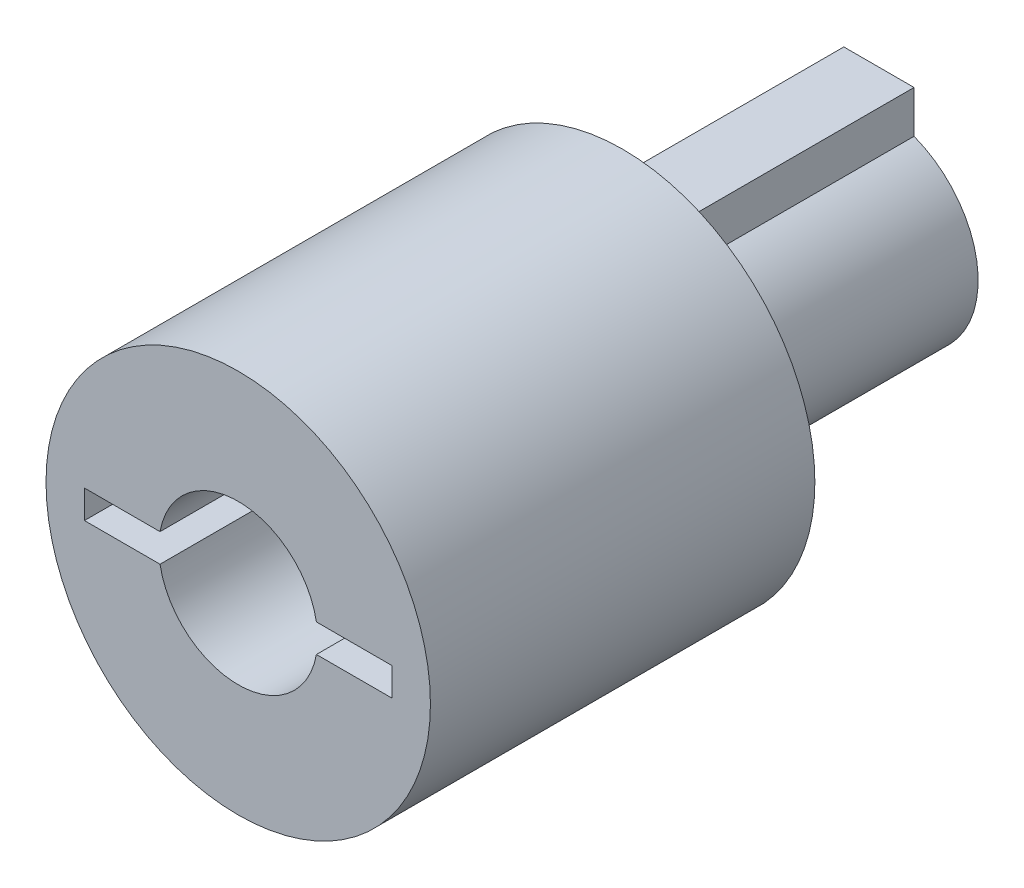
ISO-10303-21;
HEADER;
FILE_DESCRIPTION(('STEP AP214'),'2;1');
FILE_NAME('part.step','',(''),(''),'','','');
FILE_SCHEMA(('AUTOMOTIVE_DESIGN { 1 0 10303 214 1 1 1 1 }'));
ENDSEC;
DATA;
#1=APPLICATION_CONTEXT('core data for automotive mechanical design processes');
#2=APPLICATION_PROTOCOL_DEFINITION('international standard','automotive_design',2000,#1);
#3=PRODUCT_CONTEXT('',#1,'mechanical');
#4=PRODUCT('Part','Part','',(#3));
#5=PRODUCT_RELATED_PRODUCT_CATEGORY('part','',(#4));
#6=PRODUCT_DEFINITION_FORMATION('','',#4);
#7=PRODUCT_DEFINITION_CONTEXT('part definition',#1,'design');
#8=PRODUCT_DEFINITION('design','',#6,#7);
#9=PRODUCT_DEFINITION_SHAPE('','',#8);
#10=(LENGTH_UNIT() NAMED_UNIT(*) SI_UNIT(.MILLI.,.METRE.));
#11=(NAMED_UNIT(*) PLANE_ANGLE_UNIT() SI_UNIT($,.RADIAN.));
#12=(NAMED_UNIT(*) SI_UNIT($,.STERADIAN.) SOLID_ANGLE_UNIT());
#13=UNCERTAINTY_MEASURE_WITH_UNIT(LENGTH_MEASURE(1.E-05),#10,'distance_accuracy_value','');
#14=(GEOMETRIC_REPRESENTATION_CONTEXT(3) GLOBAL_UNCERTAINTY_ASSIGNED_CONTEXT((#13)) GLOBAL_UNIT_ASSIGNED_CONTEXT((#10,
#11,#12)) REPRESENTATION_CONTEXT('',''));
#15=CARTESIAN_POINT('',(0.,0.,0.));
#16=DIRECTION('',(0.,0.,1.));
#17=DIRECTION('',(1.,0.,0.));
#18=AXIS2_PLACEMENT_3D('',#15,#16,#17);
#19=CARTESIAN_POINT('',(0.,0.,15.));
#20=DIRECTION('',(0.,0.,1.));
#21=DIRECTION('',(1.,0.,0.));
#22=AXIS2_PLACEMENT_3D('',#19,#20,#21);
#23=PLANE('',#22);
#24=CARTESIAN_POINT('',(0.,0.,15.));
#25=DIRECTION('',(0.,0.,1.));
#26=DIRECTION('',(1.,0.,0.));
#27=AXIS2_PLACEMENT_3D('',#24,#25,#26);
#28=CIRCLE('',#27,7.5);
#29=CARTESIAN_POINT('',(7.5,0.,15.));
#30=VERTEX_POINT('',#29);
#31=EDGE_CURVE('E192',#30,#30,#28,.T.);
#32=ORIENTED_EDGE('',*,*,#31,.T.);
#33=EDGE_LOOP('',(#32));
#34=FACE_BOUND('',#33,.T.);
#35=CARTESIAN_POINT('',(0.,0.,15.));
#36=DIRECTION('',(0.,0.,1.));
#37=DIRECTION('',(1.,0.,0.));
#38=AXIS2_PLACEMENT_3D('',#35,#36,#37);
#39=CIRCLE('',#38,3.1);
#40=CARTESIAN_POINT('',(3.05081956201936,0.55,15.));
#41=VERTEX_POINT('',#40);
#42=CARTESIAN_POINT('',(-3.05081956201936,0.55,15.));
#43=VERTEX_POINT('',#42);
#44=EDGE_CURVE('E189',#41,#43,#39,.T.);
#45=ORIENTED_EDGE('',*,*,#44,.F.);
#46=DIRECTION('',(1.,0.,0.));
#47=VECTOR('',#46,1.);
#48=CARTESIAN_POINT('',(0.,0.55,15.));
#49=LINE('',#48,#47);
#50=CARTESIAN_POINT('',(6.,0.55,15.));
#51=VERTEX_POINT('',#50);
#52=EDGE_CURVE('E158',#41,#51,#49,.T.);
#53=ORIENTED_EDGE('',*,*,#52,.T.);
#54=DIRECTION('',(0.,1.,0.));
#55=VECTOR('',#54,1.);
#56=CARTESIAN_POINT('',(6.,0.,15.));
#57=LINE('',#56,#55);
#58=CARTESIAN_POINT('',(6.,-0.55,15.));
#59=VERTEX_POINT('',#58);
#60=EDGE_CURVE('E168',#59,#51,#57,.T.);
#61=ORIENTED_EDGE('',*,*,#60,.F.);
#62=DIRECTION('',(-1.,0.,0.));
#63=VECTOR('',#62,1.);
#64=CARTESIAN_POINT('',(0.,-0.55,15.));
#65=LINE('',#64,#63);
#66=CARTESIAN_POINT('',(3.05081956201936,-0.55,15.));
#67=VERTEX_POINT('',#66);
#68=EDGE_CURVE('E165',#59,#67,#65,.T.);
#69=ORIENTED_EDGE('',*,*,#68,.T.);
#70=CARTESIAN_POINT('',(-3.05081956201936,-0.55,15.));
#71=VERTEX_POINT('',#70);
#72=EDGE_CURVE('E183',#71,#67,#39,.T.);
#73=ORIENTED_EDGE('',*,*,#72,.F.);
#74=CARTESIAN_POINT('',(-6.,-0.55,15.));
#75=VERTEX_POINT('',#74);
#76=EDGE_CURVE('E164',#71,#75,#65,.T.);
#77=ORIENTED_EDGE('',*,*,#76,.T.);
#78=DIRECTION('',(0.,-1.,0.));
#79=VECTOR('',#78,1.);
#80=CARTESIAN_POINT('',(-6.,0.,15.));
#81=LINE('',#80,#79);
#82=CARTESIAN_POINT('',(-6.,0.55,15.));
#83=VERTEX_POINT('',#82);
#84=EDGE_CURVE('E149',#83,#75,#81,.T.);
#85=ORIENTED_EDGE('',*,*,#84,.F.);
#86=EDGE_CURVE('E155',#83,#43,#49,.T.);
#87=ORIENTED_EDGE('',*,*,#86,.T.);
#88=EDGE_LOOP('',(#45,#53,#61,#69,#73,#77,#85,#87));
#89=FACE_BOUND('',#88,.T.);
#90=ADVANCED_FACE('F33',(#34,#89),#23,.T.);
#91=CARTESIAN_POINT('',(0.,0.,6.));
#92=DIRECTION('',(0.,0.,1.));
#93=DIRECTION('',(1.,0.,0.));
#94=AXIS2_PLACEMENT_3D('',#91,#92,#93);
#95=CYLINDRICAL_SURFACE('',#94,3.1);
#96=DIRECTION('',(0.,0.,1.));
#97=VECTOR('',#96,1.);
#98=CARTESIAN_POINT('',(3.05081956201936,0.55,6.));
#99=LINE('',#98,#97);
#100=CARTESIAN_POINT('',(3.05081956201936,0.55,6.));
#101=VERTEX_POINT('',#100);
#102=EDGE_CURVE('E181',#41,#101,#99,.F.);
#103=ORIENTED_EDGE('',*,*,#102,.F.);
#104=ORIENTED_EDGE('',*,*,#44,.T.);
#105=DIRECTION('',(0.,0.,1.));
#106=VECTOR('',#105,1.);
#107=CARTESIAN_POINT('',(-3.05081956201936,0.55,6.));
#108=LINE('',#107,#106);
#109=CARTESIAN_POINT('',(-3.05081956201936,0.55,6.));
#110=VERTEX_POINT('',#109);
#111=EDGE_CURVE('E179',#110,#43,#108,.T.);
#112=ORIENTED_EDGE('',*,*,#111,.F.);
#113=CARTESIAN_POINT('',(0.,0.,6.));
#114=DIRECTION('',(0.,0.,1.));
#115=DIRECTION('',(1.,0.,0.));
#116=AXIS2_PLACEMENT_3D('',#113,#114,#115);
#117=CIRCLE('',#116,3.1);
#118=EDGE_CURVE('E184',#101,#110,#117,.T.);
#119=ORIENTED_EDGE('',*,*,#118,.F.);
#120=EDGE_LOOP('',(#103,#104,#112,#119));
#121=FACE_BOUND('',#120,.T.);
#122=ADVANCED_FACE('F244',(#121),#95,.F.);
#123=DIRECTION('',(0.,0.,1.));
#124=VECTOR('',#123,1.);
#125=CARTESIAN_POINT('',(-3.05081956201936,-0.55,6.));
#126=LINE('',#125,#124);
#127=CARTESIAN_POINT('',(-3.05081956201936,-0.55,6.));
#128=VERTEX_POINT('',#127);
#129=EDGE_CURVE('E48',#71,#128,#126,.F.);
#130=ORIENTED_EDGE('',*,*,#129,.F.);
#131=ORIENTED_EDGE('',*,*,#72,.T.);
#132=DIRECTION('',(0.,0.,1.));
#133=VECTOR('',#132,1.);
#134=CARTESIAN_POINT('',(3.05081956201936,-0.55,6.));
#135=LINE('',#134,#133);
#136=CARTESIAN_POINT('',(3.05081956201936,-0.55,6.));
#137=VERTEX_POINT('',#136);
#138=EDGE_CURVE('E173',#137,#67,#135,.T.);
#139=ORIENTED_EDGE('',*,*,#138,.F.);
#140=EDGE_CURVE('E188',#128,#137,#117,.T.);
#141=ORIENTED_EDGE('',*,*,#140,.F.);
#142=EDGE_LOOP('',(#130,#131,#139,#141));
#143=FACE_BOUND('',#142,.T.);
#144=ADVANCED_FACE('F228',(#143),#95,.F.);
#145=CARTESIAN_POINT('',(0.,0.,6.));
#146=DIRECTION('',(0.,0.,1.));
#147=DIRECTION('',(1.,0.,0.));
#148=AXIS2_PLACEMENT_3D('',#145,#146,#147);
#149=PLANE('',#148);
#150=ORIENTED_EDGE('',*,*,#118,.T.);
#151=DIRECTION('',(1.,0.,0.));
#152=VECTOR('',#151,1.);
#153=CARTESIAN_POINT('',(0.,0.55,6.));
#154=LINE('',#153,#152);
#155=EDGE_CURVE('E11',#110,#101,#154,.T.);
#156=ORIENTED_EDGE('',*,*,#155,.T.);
#157=EDGE_LOOP('',(#150,#156));
#158=FACE_BOUND('',#157,.T.);
#159=ADVANCED_FACE('F247',(#158),#149,.T.);
#160=ORIENTED_EDGE('',*,*,#140,.T.);
#161=DIRECTION('',(-1.,0.,0.));
#162=VECTOR('',#161,1.);
#163=CARTESIAN_POINT('',(0.,-0.55,6.));
#164=LINE('',#163,#162);
#165=EDGE_CURVE('E41',#137,#128,#164,.T.);
#166=ORIENTED_EDGE('',*,*,#165,.T.);
#167=EDGE_LOOP('',(#160,#166));
#168=FACE_BOUND('',#167,.T.);
#169=ADVANCED_FACE('F225',(#168),#149,.T.);
#170=CARTESIAN_POINT('',(1.37,5.27,-10.));
#171=DIRECTION('',(0.,1.,0.));
#172=DIRECTION('',(0.,0.,1.));
#173=AXIS2_PLACEMENT_3D('',#170,#171,#172);
#174=PLANE('',#173);
#175=DIRECTION('',(-1.,0.,0.));
#176=VECTOR('',#175,1.);
#177=CARTESIAN_POINT('',(1.37,5.27,0.));
#178=LINE('',#177,#176);
#179=CARTESIAN_POINT('',(1.37,5.27,0.));
#180=VERTEX_POINT('',#179);
#181=CARTESIAN_POINT('',(-1.37,5.27,0.));
#182=VERTEX_POINT('',#181);
#183=EDGE_CURVE('E195',#180,#182,#178,.T.);
#184=ORIENTED_EDGE('',*,*,#183,.F.);
#185=DIRECTION('',(0.,0.,1.));
#186=VECTOR('',#185,1.);
#187=CARTESIAN_POINT('',(1.37,5.27,-10.));
#188=LINE('',#187,#186);
#189=CARTESIAN_POINT('',(1.37,5.27,-10.));
#190=VERTEX_POINT('',#189);
#191=EDGE_CURVE('E57',#190,#180,#188,.T.);
#192=ORIENTED_EDGE('',*,*,#191,.F.);
#193=DIRECTION('',(-1.,0.,0.));
#194=VECTOR('',#193,1.);
#195=CARTESIAN_POINT('',(1.37,5.27,-10.));
#196=LINE('',#195,#194);
#197=CARTESIAN_POINT('',(-1.37,5.27,-10.));
#198=VERTEX_POINT('',#197);
#199=EDGE_CURVE('E198',#190,#198,#196,.T.);
#200=ORIENTED_EDGE('',*,*,#199,.T.);
#201=DIRECTION('',(0.,0.,1.));
#202=VECTOR('',#201,1.);
#203=CARTESIAN_POINT('',(-1.37,5.27,-10.));
#204=LINE('',#203,#202);
#205=EDGE_CURVE('E83',#198,#182,#204,.T.);
#206=ORIENTED_EDGE('',*,*,#205,.T.);
#207=EDGE_LOOP('',(#184,#192,#200,#206));
#208=FACE_BOUND('',#207,.T.);
#209=ADVANCED_FACE('F35',(#208),#174,.T.);
#210=CARTESIAN_POINT('',(1.37,3.61939221417077,-10.));
#211=DIRECTION('',(1.,0.,0.));
#212=DIRECTION('',(0.,0.,-1.));
#213=AXIS2_PLACEMENT_3D('',#210,#211,#212);
#214=PLANE('',#213);
#215=DIRECTION('',(0.,1.,0.));
#216=VECTOR('',#215,1.);
#217=CARTESIAN_POINT('',(1.37,3.61939221417077,0.));
#218=LINE('',#217,#216);
#219=CARTESIAN_POINT('',(1.37,3.61939221417077,0.));
#220=VERTEX_POINT('',#219);
#221=EDGE_CURVE('E201',#220,#180,#218,.T.);
#222=ORIENTED_EDGE('',*,*,#221,.F.);
#223=DIRECTION('',(0.,0.,1.));
#224=VECTOR('',#223,1.);
#225=CARTESIAN_POINT('',(1.37,3.61939221417077,-10.));
#226=LINE('',#225,#224);
#227=CARTESIAN_POINT('',(1.37,3.61939221417077,-10.));
#228=VERTEX_POINT('',#227);
#229=EDGE_CURVE('E76',#228,#220,#226,.T.);
#230=ORIENTED_EDGE('',*,*,#229,.F.);
#231=DIRECTION('',(0.,1.,0.));
#232=VECTOR('',#231,1.);
#233=CARTESIAN_POINT('',(1.37,3.61939221417077,-10.));
#234=LINE('',#233,#232);
#235=EDGE_CURVE('E205',#228,#190,#234,.T.);
#236=ORIENTED_EDGE('',*,*,#235,.T.);
#237=ORIENTED_EDGE('',*,*,#191,.T.);
#238=EDGE_LOOP('',(#222,#230,#236,#237));
#239=FACE_BOUND('',#238,.T.);
#240=ADVANCED_FACE('F276',(#239),#214,.T.);
#241=CARTESIAN_POINT('',(0.,0.,-10.));
#242=DIRECTION('',(0.,0.,1.));
#243=DIRECTION('',(1.,0.,0.));
#244=AXIS2_PLACEMENT_3D('',#241,#242,#243);
#245=CYLINDRICAL_SURFACE('',#244,3.87);
#246=CARTESIAN_POINT('',(0.,0.,0.));
#247=DIRECTION('',(0.,0.,1.));
#248=DIRECTION('',(1.,0.,0.));
#249=AXIS2_PLACEMENT_3D('',#246,#247,#248);
#250=CIRCLE('',#249,3.87);
#251=CARTESIAN_POINT('',(-1.37,3.61939221417077,0.));
#252=VERTEX_POINT('',#251);
#253=EDGE_CURVE('E213',#252,#220,#250,.T.);
#254=ORIENTED_EDGE('',*,*,#253,.F.);
#255=DIRECTION('',(0.,0.,1.));
#256=VECTOR('',#255,1.);
#257=CARTESIAN_POINT('',(-1.37,3.61939221417077,-10.));
#258=LINE('',#257,#256);
#259=CARTESIAN_POINT('',(-1.37,3.61939221417077,-10.));
#260=VERTEX_POINT('',#259);
#261=EDGE_CURVE('E220',#260,#252,#258,.T.);
#262=ORIENTED_EDGE('',*,*,#261,.F.);
#263=CARTESIAN_POINT('',(0.,0.,-10.));
#264=DIRECTION('',(0.,0.,1.));
#265=DIRECTION('',(1.,0.,0.));
#266=AXIS2_PLACEMENT_3D('',#263,#264,#265);
#267=CIRCLE('',#266,3.87);
#268=EDGE_CURVE('E203',#260,#228,#267,.T.);
#269=ORIENTED_EDGE('',*,*,#268,.T.);
#270=ORIENTED_EDGE('',*,*,#229,.T.);
#271=EDGE_LOOP('',(#254,#262,#269,#270));
#272=FACE_BOUND('',#271,.T.);
#273=ADVANCED_FACE('F279',(#272),#245,.T.);
#274=CARTESIAN_POINT('',(-1.37,5.27,-10.));
#275=DIRECTION('',(-1.,0.,0.));
#276=DIRECTION('',(0.,0.,1.));
#277=AXIS2_PLACEMENT_3D('',#274,#275,#276);
#278=PLANE('',#277);
#279=DIRECTION('',(0.,-1.,0.));
#280=VECTOR('',#279,1.);
#281=CARTESIAN_POINT('',(-1.37,5.27,0.));
#282=LINE('',#281,#280);
#283=EDGE_CURVE('E210',#182,#252,#282,.T.);
#284=ORIENTED_EDGE('',*,*,#283,.F.);
#285=ORIENTED_EDGE('',*,*,#205,.F.);
#286=DIRECTION('',(0.,-1.,0.));
#287=VECTOR('',#286,1.);
#288=CARTESIAN_POINT('',(-1.37,5.27,-10.));
#289=LINE('',#288,#287);
#290=EDGE_CURVE('E200',#198,#260,#289,.T.);
#291=ORIENTED_EDGE('',*,*,#290,.T.);
#292=ORIENTED_EDGE('',*,*,#261,.T.);
#293=EDGE_LOOP('',(#284,#285,#291,#292));
#294=FACE_BOUND('',#293,.T.);
#295=ADVANCED_FACE('F274',(#294),#278,.T.);
#296=CARTESIAN_POINT('',(0.,0.,-10.));
#297=DIRECTION('',(0.,0.,1.));
#298=DIRECTION('',(1.,0.,0.));
#299=AXIS2_PLACEMENT_3D('',#296,#297,#298);
#300=PLANE('',#299);
#301=ORIENTED_EDGE('',*,*,#199,.F.);
#302=ORIENTED_EDGE('',*,*,#235,.F.);
#303=ORIENTED_EDGE('',*,*,#268,.F.);
#304=ORIENTED_EDGE('',*,*,#290,.F.);
#305=EDGE_LOOP('',(#301,#302,#303,#304));
#306=FACE_BOUND('',#305,.T.);
#307=ADVANCED_FACE('F267',(#306),#300,.F.);
#308=CARTESIAN_POINT('',(0.,0.,0.));
#309=DIRECTION('',(0.,0.,1.));
#310=DIRECTION('',(1.,0.,0.));
#311=AXIS2_PLACEMENT_3D('',#308,#309,#310);
#312=PLANE('',#311);
#313=CARTESIAN_POINT('',(0.,0.,0.));
#314=DIRECTION('',(0.,0.,1.));
#315=DIRECTION('',(1.,0.,0.));
#316=AXIS2_PLACEMENT_3D('',#313,#314,#315);
#317=CIRCLE('',#316,7.5);
#318=CARTESIAN_POINT('',(7.5,0.,0.));
#319=VERTEX_POINT('',#318);
#320=EDGE_CURVE('E187',#319,#319,#317,.T.);
#321=ORIENTED_EDGE('',*,*,#320,.F.);
#322=EDGE_LOOP('',(#321));
#323=FACE_BOUND('',#322,.T.);
#324=ORIENTED_EDGE('',*,*,#221,.T.);
#325=ORIENTED_EDGE('',*,*,#183,.T.);
#326=ORIENTED_EDGE('',*,*,#283,.T.);
#327=ORIENTED_EDGE('',*,*,#253,.T.);
#328=EDGE_LOOP('',(#324,#325,#326,#327));
#329=FACE_BOUND('',#328,.T.);
#330=ADVANCED_FACE('F263',(#323,#329),#312,.F.);
#331=CARTESIAN_POINT('',(0.,0.,15.));
#332=DIRECTION('',(0.,0.,-1.));
#333=DIRECTION('',(-1.,0.,0.));
#334=AXIS2_PLACEMENT_3D('',#331,#332,#333);
#335=CYLINDRICAL_SURFACE('',#334,7.5);
#336=ORIENTED_EDGE('',*,*,#31,.F.);
#337=EDGE_LOOP('',(#336));
#338=FACE_BOUND('',#337,.T.);
#339=ORIENTED_EDGE('',*,*,#320,.T.);
#340=EDGE_LOOP('',(#339));
#341=FACE_BOUND('',#340,.T.);
#342=ADVANCED_FACE('F266',(#338,#341),#335,.T.);
#343=CARTESIAN_POINT('',(0.,0.55,2.));
#344=DIRECTION('',(0.,-1.,0.));
#345=DIRECTION('',(0.,0.,-1.));
#346=AXIS2_PLACEMENT_3D('',#343,#344,#345);
#347=PLANE('',#346);
#348=ORIENTED_EDGE('',*,*,#102,.T.);
#349=ORIENTED_EDGE('',*,*,#155,.F.);
#350=ORIENTED_EDGE('',*,*,#111,.T.);
#351=ORIENTED_EDGE('',*,*,#86,.F.);
#352=DIRECTION('',(0.,0.,1.));
#353=VECTOR('',#352,1.);
#354=CARTESIAN_POINT('',(-6.,0.55,2.));
#355=LINE('',#354,#353);
#356=CARTESIAN_POINT('',(-6.,0.55,2.));
#357=VERTEX_POINT('',#356);
#358=EDGE_CURVE('E171',#357,#83,#355,.T.);
#359=ORIENTED_EDGE('',*,*,#358,.F.);
#360=DIRECTION('',(1.,0.,0.));
#361=VECTOR('',#360,1.);
#362=CARTESIAN_POINT('',(0.,0.55,2.));
#363=LINE('',#362,#361);
#364=CARTESIAN_POINT('',(6.,0.55,2.));
#365=VERTEX_POINT('',#364);
#366=EDGE_CURVE('E151',#357,#365,#363,.T.);
#367=ORIENTED_EDGE('',*,*,#366,.T.);
#368=DIRECTION('',(0.,0.,1.));
#369=VECTOR('',#368,1.);
#370=CARTESIAN_POINT('',(6.,0.55,2.));
#371=LINE('',#370,#369);
#372=EDGE_CURVE('E174',#365,#51,#371,.T.);
#373=ORIENTED_EDGE('',*,*,#372,.T.);
#374=ORIENTED_EDGE('',*,*,#52,.F.);
#375=EDGE_LOOP('',(#348,#349,#350,#351,#359,#367,#373,#374));
#376=FACE_BOUND('',#375,.T.);
#377=ADVANCED_FACE('F239',(#376),#347,.T.);
#378=CARTESIAN_POINT('',(0.,-0.55,2.));
#379=DIRECTION('',(0.,1.,0.));
#380=DIRECTION('',(0.,0.,1.));
#381=AXIS2_PLACEMENT_3D('',#378,#379,#380);
#382=PLANE('',#381);
#383=ORIENTED_EDGE('',*,*,#129,.T.);
#384=ORIENTED_EDGE('',*,*,#165,.F.);
#385=ORIENTED_EDGE('',*,*,#138,.T.);
#386=ORIENTED_EDGE('',*,*,#68,.F.);
#387=DIRECTION('',(0.,0.,1.));
#388=VECTOR('',#387,1.);
#389=CARTESIAN_POINT('',(6.,-0.55,2.));
#390=LINE('',#389,#388);
#391=CARTESIAN_POINT('',(6.,-0.55,2.));
#392=VERTEX_POINT('',#391);
#393=EDGE_CURVE('E137',#392,#59,#390,.T.);
#394=ORIENTED_EDGE('',*,*,#393,.F.);
#395=DIRECTION('',(-1.,0.,0.));
#396=VECTOR('',#395,1.);
#397=CARTESIAN_POINT('',(0.,-0.55,2.));
#398=LINE('',#397,#396);
#399=CARTESIAN_POINT('',(-6.,-0.55,2.));
#400=VERTEX_POINT('',#399);
#401=EDGE_CURVE('E131',#392,#400,#398,.T.);
#402=ORIENTED_EDGE('',*,*,#401,.T.);
#403=DIRECTION('',(0.,0.,1.));
#404=VECTOR('',#403,1.);
#405=CARTESIAN_POINT('',(-6.,-0.55,2.));
#406=LINE('',#405,#404);
#407=EDGE_CURVE('E134',#400,#75,#406,.T.);
#408=ORIENTED_EDGE('',*,*,#407,.T.);
#409=ORIENTED_EDGE('',*,*,#76,.F.);
#410=EDGE_LOOP('',(#383,#384,#385,#386,#394,#402,#408,#409));
#411=FACE_BOUND('',#410,.T.);
#412=ADVANCED_FACE('F133',(#411),#382,.T.);
#413=CARTESIAN_POINT('',(-6.,0.,2.));
#414=DIRECTION('',(-1.,0.,0.));
#415=DIRECTION('',(0.,0.,1.));
#416=AXIS2_PLACEMENT_3D('',#413,#414,#415);
#417=PLANE('',#416);
#418=ORIENTED_EDGE('',*,*,#84,.T.);
#419=ORIENTED_EDGE('',*,*,#407,.F.);
#420=DIRECTION('',(0.,-1.,0.));
#421=VECTOR('',#420,1.);
#422=CARTESIAN_POINT('',(-6.,0.,2.));
#423=LINE('',#422,#421);
#424=EDGE_CURVE('E143',#357,#400,#423,.T.);
#425=ORIENTED_EDGE('',*,*,#424,.F.);
#426=ORIENTED_EDGE('',*,*,#358,.T.);
#427=EDGE_LOOP('',(#418,#419,#425,#426));
#428=FACE_BOUND('',#427,.T.);
#429=ADVANCED_FACE('F147',(#428),#417,.F.);
#430=CARTESIAN_POINT('',(6.,0.,2.));
#431=DIRECTION('',(1.,0.,0.));
#432=DIRECTION('',(0.,0.,-1.));
#433=AXIS2_PLACEMENT_3D('',#430,#431,#432);
#434=PLANE('',#433);
#435=ORIENTED_EDGE('',*,*,#60,.T.);
#436=ORIENTED_EDGE('',*,*,#372,.F.);
#437=DIRECTION('',(0.,1.,0.));
#438=VECTOR('',#437,1.);
#439=CARTESIAN_POINT('',(6.,0.,2.));
#440=LINE('',#439,#438);
#441=EDGE_CURVE('E142',#392,#365,#440,.T.);
#442=ORIENTED_EDGE('',*,*,#441,.F.);
#443=ORIENTED_EDGE('',*,*,#393,.T.);
#444=EDGE_LOOP('',(#435,#436,#442,#443));
#445=FACE_BOUND('',#444,.T.);
#446=ADVANCED_FACE('F237',(#445),#434,.F.);
#447=CARTESIAN_POINT('',(0.,0.,2.));
#448=DIRECTION('',(0.,0.,1.));
#449=DIRECTION('',(1.,0.,0.));
#450=AXIS2_PLACEMENT_3D('',#447,#448,#449);
#451=PLANE('',#450);
#452=ORIENTED_EDGE('',*,*,#424,.T.);
#453=ORIENTED_EDGE('',*,*,#401,.F.);
#454=ORIENTED_EDGE('',*,*,#441,.T.);
#455=ORIENTED_EDGE('',*,*,#366,.F.);
#456=EDGE_LOOP('',(#452,#453,#454,#455));
#457=FACE_BOUND('',#456,.T.);
#458=ADVANCED_FACE('F154',(#457),#451,.T.);
#459=CLOSED_SHELL('',(#90,#122,#144,#159,#169,#209,#240,#273,#295,#307,#330,#342,#377,#412,#429,
#446,#458));
#460=MANIFOLD_SOLID_BREP('B2',#459);
#461=ADVANCED_BREP_SHAPE_REPRESENTATION('',(#18,#460),#14);
#462=SHAPE_DEFINITION_REPRESENTATION(#9,#461);
ENDSEC;
END-ISO-10303-21;
